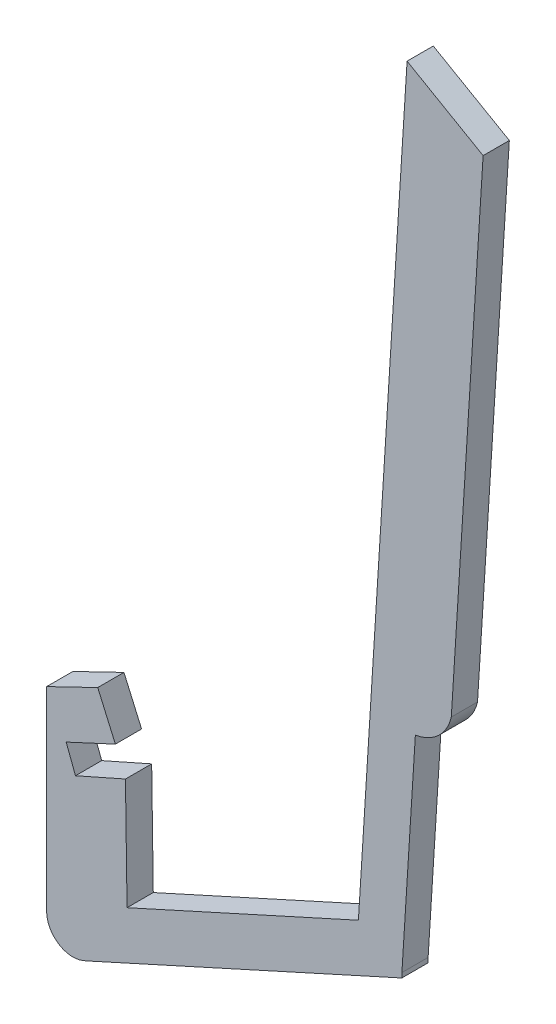
ISO-10303-21;
HEADER;
FILE_DESCRIPTION(('STEP AP214'),'2;1');
FILE_NAME('part.step','',(''),(''),'','','');
FILE_SCHEMA(('AUTOMOTIVE_DESIGN { 1 0 10303 214 1 1 1 1 }'));
ENDSEC;
DATA;
#1=APPLICATION_CONTEXT('core data for automotive mechanical design processes');
#2=APPLICATION_PROTOCOL_DEFINITION('international standard','automotive_design',2000,#1);
#3=PRODUCT_CONTEXT('',#1,'mechanical');
#4=PRODUCT('Part','Part','',(#3));
#5=PRODUCT_RELATED_PRODUCT_CATEGORY('part','',(#4));
#6=PRODUCT_DEFINITION_FORMATION('','',#4);
#7=PRODUCT_DEFINITION_CONTEXT('part definition',#1,'design');
#8=PRODUCT_DEFINITION('design','',#6,#7);
#9=PRODUCT_DEFINITION_SHAPE('','',#8);
#10=(LENGTH_UNIT() NAMED_UNIT(*) SI_UNIT(.MILLI.,.METRE.));
#11=(NAMED_UNIT(*) PLANE_ANGLE_UNIT() SI_UNIT($,.RADIAN.));
#12=(NAMED_UNIT(*) SI_UNIT($,.STERADIAN.) SOLID_ANGLE_UNIT());
#13=UNCERTAINTY_MEASURE_WITH_UNIT(LENGTH_MEASURE(1.E-05),#10,'distance_accuracy_value','');
#14=(GEOMETRIC_REPRESENTATION_CONTEXT(3) GLOBAL_UNCERTAINTY_ASSIGNED_CONTEXT((#13)) GLOBAL_UNIT_ASSIGNED_CONTEXT((#10,
#11,#12)) REPRESENTATION_CONTEXT('',''));
#15=CARTESIAN_POINT('',(0.,0.,0.));
#16=DIRECTION('',(0.,0.,1.));
#17=DIRECTION('',(1.,0.,0.));
#18=AXIS2_PLACEMENT_3D('',#15,#16,#17);
#19=CARTESIAN_POINT('',(787.90645832663,-50.9585268550928,3.));
#20=DIRECTION('',(0.,0.,-1.));
#21=DIRECTION('',(-1.,0.,0.));
#22=AXIS2_PLACEMENT_3D('',#19,#20,#21);
#23=CYLINDRICAL_SURFACE('',#22,10.);
#24=CARTESIAN_POINT('',(787.90645832663,-50.9585268550928,0.));
#25=DIRECTION('',(0.,0.,1.));
#26=DIRECTION('',(-1.,0.,0.));
#27=AXIS2_PLACEMENT_3D('',#24,#25,#26);
#28=CIRCLE('',#27,10.);
#29=CARTESIAN_POINT('',(791.364238457748,-60.3416903176382,0.));
#30=VERTEX_POINT('',#29);
#31=CARTESIAN_POINT('',(792.033370233897,-60.0672368685721,0.));
#32=VERTEX_POINT('',#31);
#33=EDGE_CURVE('E184',#30,#32,#28,.T.);
#34=ORIENTED_EDGE('',*,*,#33,.T.);
#35=DIRECTION('',(0.,0.,-1.));
#36=VECTOR('',#35,1.);
#37=CARTESIAN_POINT('',(792.033370233897,-60.0672368685721,3.));
#38=LINE('',#37,#36);
#39=CARTESIAN_POINT('',(792.033370233897,-60.0672368685721,3.));
#40=VERTEX_POINT('',#39);
#41=EDGE_CURVE('E11',#40,#32,#38,.T.);
#42=ORIENTED_EDGE('',*,*,#41,.F.);
#43=CARTESIAN_POINT('',(787.90645832663,-50.9585268550928,3.));
#44=DIRECTION('',(0.,0.,1.));
#45=DIRECTION('',(-1.,0.,0.));
#46=AXIS2_PLACEMENT_3D('',#43,#44,#45);
#47=CIRCLE('',#46,10.);
#48=CARTESIAN_POINT('',(791.364238457748,-60.3416903176382,3.));
#49=VERTEX_POINT('',#48);
#50=EDGE_CURVE('E216',#49,#40,#47,.T.);
#51=ORIENTED_EDGE('',*,*,#50,.F.);
#52=DIRECTION('',(0.,0.,-1.));
#53=VECTOR('',#52,1.);
#54=CARTESIAN_POINT('',(791.364238457748,-60.3416903176382,3.));
#55=LINE('',#54,#53);
#56=EDGE_CURVE('E180',#49,#30,#55,.T.);
#57=ORIENTED_EDGE('',*,*,#56,.T.);
#58=EDGE_LOOP('',(#34,#42,#51,#57));
#59=FACE_BOUND('',#58,.T.);
#60=ADVANCED_FACE('F34',(#59),#23,.T.);
#61=CARTESIAN_POINT('',(792.033370233897,-60.0672368685721,3.));
#62=DIRECTION('',(-0.412691190726717,0.910871001347921,0.));
#63=DIRECTION('',(-0.910871001347921,-0.412691190726717,0.));
#64=AXIS2_PLACEMENT_3D('',#61,#62,#63);
#65=PLANE('',#64);
#66=DIRECTION('',(0.910871001347921,0.412691190726717,0.));
#67=VECTOR('',#66,1.);
#68=CARTESIAN_POINT('',(792.033370233897,-60.0672368685721,0.));
#69=LINE('',#68,#67);
#70=CARTESIAN_POINT('',(827.968278958337,-43.7860947000329,0.));
#71=VERTEX_POINT('',#70);
#72=EDGE_CURVE('E187',#32,#71,#69,.T.);
#73=ORIENTED_EDGE('',*,*,#72,.T.);
#74=DIRECTION('',(0.,0.,-1.));
#75=VECTOR('',#74,1.);
#76=CARTESIAN_POINT('',(827.968278958337,-43.7860947000329,3.));
#77=LINE('',#76,#75);
#78=CARTESIAN_POINT('',(827.968278958337,-43.7860947000329,3.));
#79=VERTEX_POINT('',#78);
#80=EDGE_CURVE('E42',#79,#71,#77,.T.);
#81=ORIENTED_EDGE('',*,*,#80,.F.);
#82=DIRECTION('',(0.910871001347921,0.412691190726717,0.));
#83=VECTOR('',#82,1.);
#84=CARTESIAN_POINT('',(792.033370233897,-60.0672368685721,3.));
#85=LINE('',#84,#83);
#86=EDGE_CURVE('E120',#40,#79,#85,.T.);
#87=ORIENTED_EDGE('',*,*,#86,.F.);
#88=ORIENTED_EDGE('',*,*,#41,.T.);
#89=EDGE_LOOP('',(#73,#81,#87,#88));
#90=FACE_BOUND('',#89,.T.);
#91=ADVANCED_FACE('F319',(#90),#65,.F.);
#92=CARTESIAN_POINT('',(817.975334928289,-43.4105023514463,3.));
#93=DIRECTION('',(0.,0.,-1.));
#94=DIRECTION('',(-1.,0.,0.));
#95=AXIS2_PLACEMENT_3D('',#92,#93,#94);
#96=CYLINDRICAL_SURFACE('',#95,10.);
#97=CARTESIAN_POINT('',(817.975334928289,-43.4105023514463,0.));
#98=DIRECTION('',(0.,0.,1.));
#99=DIRECTION('',(1.,0.,0.));
#100=AXIS2_PLACEMENT_3D('',#97,#98,#99);
#101=CIRCLE('',#100,10.);
#102=CARTESIAN_POINT('',(827.973978263207,-43.2457860465424,0.));
#103=VERTEX_POINT('',#102);
#104=EDGE_CURVE('E189',#71,#103,#101,.T.);
#105=ORIENTED_EDGE('',*,*,#104,.T.);
#106=DIRECTION('',(0.,0.,-1.));
#107=VECTOR('',#106,1.);
#108=CARTESIAN_POINT('',(827.973978263207,-43.2457860465424,3.));
#109=LINE('',#108,#107);
#110=CARTESIAN_POINT('',(827.973978263207,-43.2457860465424,3.));
#111=VERTEX_POINT('',#110);
#112=EDGE_CURVE('E250',#111,#103,#109,.T.);
#113=ORIENTED_EDGE('',*,*,#112,.F.);
#114=CARTESIAN_POINT('',(817.975334928289,-43.4105023514463,3.));
#115=DIRECTION('',(0.,0.,1.));
#116=DIRECTION('',(1.,0.,0.));
#117=AXIS2_PLACEMENT_3D('',#114,#115,#116);
#118=CIRCLE('',#117,10.);
#119=EDGE_CURVE('E258',#79,#111,#118,.T.);
#120=ORIENTED_EDGE('',*,*,#119,.F.);
#121=ORIENTED_EDGE('',*,*,#80,.T.);
#122=EDGE_LOOP('',(#105,#113,#120,#121));
#123=FACE_BOUND('',#122,.T.);
#124=ADVANCED_FACE('F256',(#123),#96,.T.);
#125=CARTESIAN_POINT('',(827.973978263207,-43.2457860465424,3.));
#126=DIRECTION('',(-0.997998136303589,0.0632433390529176,0.));
#127=DIRECTION('',(-0.0632433390529176,-0.997998136303589,0.));
#128=AXIS2_PLACEMENT_3D('',#125,#126,#127);
#129=PLANE('',#128);
#130=DIRECTION('',(0.0632433390529176,0.997998136303589,0.));
#131=VECTOR('',#130,1.);
#132=CARTESIAN_POINT('',(827.973978263207,-43.2457860465424,0.));
#133=LINE('',#132,#131);
#134=CARTESIAN_POINT('',(829.514372585773,-18.9379192242762,0.));
#135=VERTEX_POINT('',#134);
#136=EDGE_CURVE('E191',#103,#135,#133,.T.);
#137=ORIENTED_EDGE('',*,*,#136,.T.);
#138=DIRECTION('',(0.,0.,-1.));
#139=VECTOR('',#138,1.);
#140=CARTESIAN_POINT('',(829.514372585773,-18.9379192242762,3.));
#141=LINE('',#140,#139);
#142=CARTESIAN_POINT('',(829.514372585773,-18.9379192242762,3.));
#143=VERTEX_POINT('',#142);
#144=EDGE_CURVE('E247',#143,#135,#141,.T.);
#145=ORIENTED_EDGE('',*,*,#144,.F.);
#146=DIRECTION('',(0.0632433390529176,0.997998136303589,0.));
#147=VECTOR('',#146,1.);
#148=CARTESIAN_POINT('',(827.973978263207,-43.2457860465424,3.));
#149=LINE('',#148,#147);
#150=EDGE_CURVE('E276',#111,#143,#149,.T.);
#151=ORIENTED_EDGE('',*,*,#150,.F.);
#152=ORIENTED_EDGE('',*,*,#112,.T.);
#153=EDGE_LOOP('',(#137,#145,#151,#152));
#154=FACE_BOUND('',#153,.T.);
#155=ADVANCED_FACE('F267',(#154),#129,.F.);
#156=CARTESIAN_POINT('',(828.754467182611,-14.0015073447806,3.));
#157=DIRECTION('',(0.,0.,-1.));
#158=DIRECTION('',(-1.,0.,0.));
#159=AXIS2_PLACEMENT_3D('',#156,#157,#158);
#160=CYLINDRICAL_SURFACE('',#159,4.99455888600575);
#161=CARTESIAN_POINT('',(828.754467182611,-14.0015073447806,0.));
#162=DIRECTION('',(0.,0.,1.));
#163=DIRECTION('',(-1.,0.,0.));
#164=AXIS2_PLACEMENT_3D('',#161,#162,#163);
#165=CIRCLE('',#164,4.99455888600575);
#166=CARTESIAN_POINT('',(833.626640717268,-15.1003901929362,0.));
#167=VERTEX_POINT('',#166);
#168=EDGE_CURVE('E193',#135,#167,#165,.T.);
#169=ORIENTED_EDGE('',*,*,#168,.T.);
#170=DIRECTION('',(0.,0.,-1.));
#171=VECTOR('',#170,1.);
#172=CARTESIAN_POINT('',(833.626640717268,-15.1003901929362,3.));
#173=LINE('',#172,#171);
#174=CARTESIAN_POINT('',(833.626640717268,-15.1003901929362,3.));
#175=VERTEX_POINT('',#174);
#176=EDGE_CURVE('E244',#175,#167,#173,.T.);
#177=ORIENTED_EDGE('',*,*,#176,.F.);
#178=CARTESIAN_POINT('',(828.754467182611,-14.0015073447806,3.));
#179=DIRECTION('',(0.,0.,1.));
#180=DIRECTION('',(-1.,0.,0.));
#181=AXIS2_PLACEMENT_3D('',#178,#179,#180);
#182=CIRCLE('',#181,4.99455888600575);
#183=EDGE_CURVE('E273',#143,#175,#182,.T.);
#184=ORIENTED_EDGE('',*,*,#183,.F.);
#185=ORIENTED_EDGE('',*,*,#144,.T.);
#186=EDGE_LOOP('',(#169,#177,#184,#185));
#187=FACE_BOUND('',#186,.T.);
#188=ADVANCED_FACE('F271',(#187),#160,.T.);
#189=CARTESIAN_POINT('',(833.626640717268,-15.1003901929362,3.));
#190=DIRECTION('',(-0.997998136303589,0.0632433390529181,0.));
#191=DIRECTION('',(-0.0632433390529181,-0.997998136303589,0.));
#192=AXIS2_PLACEMENT_3D('',#189,#190,#191);
#193=PLANE('',#192);
#194=DIRECTION('',(0.0632433390529181,0.997998136303589,0.));
#195=VECTOR('',#194,1.);
#196=CARTESIAN_POINT('',(833.626640717268,-15.1003901929362,0.));
#197=LINE('',#196,#195);
#198=CARTESIAN_POINT('',(837.267672807037,42.3561466412564,0.));
#199=VERTEX_POINT('',#198);
#200=EDGE_CURVE('E195',#167,#199,#197,.T.);
#201=ORIENTED_EDGE('',*,*,#200,.T.);
#202=DIRECTION('',(0.,0.,-1.));
#203=VECTOR('',#202,1.);
#204=CARTESIAN_POINT('',(837.267672807037,42.3561466412564,3.));
#205=LINE('',#204,#203);
#206=CARTESIAN_POINT('',(837.267672807037,42.3561466412564,3.));
#207=VERTEX_POINT('',#206);
#208=EDGE_CURVE('E241',#207,#199,#205,.T.);
#209=ORIENTED_EDGE('',*,*,#208,.F.);
#210=DIRECTION('',(0.0632433390529181,0.997998136303589,0.));
#211=VECTOR('',#210,1.);
#212=CARTESIAN_POINT('',(833.626640717268,-15.1003901929362,3.));
#213=LINE('',#212,#211);
#214=EDGE_CURVE('E275',#175,#207,#213,.T.);
#215=ORIENTED_EDGE('',*,*,#214,.F.);
#216=ORIENTED_EDGE('',*,*,#176,.T.);
#217=EDGE_LOOP('',(#201,#209,#215,#216));
#218=FACE_BOUND('',#217,.T.);
#219=ADVANCED_FACE('F332',(#218),#193,.F.);
#220=CARTESIAN_POINT('',(837.267672807037,42.3561466412564,3.));
#221=DIRECTION('',(-0.499064113788178,-0.866565064105876,0.));
#222=DIRECTION('',(0.866565064105876,-0.499064113788178,0.));
#223=AXIS2_PLACEMENT_3D('',#220,#221,#222);
#224=PLANE('',#223);
#225=DIRECTION('',(-0.866565064105876,0.499064113788178,0.));
#226=VECTOR('',#225,1.);
#227=CARTESIAN_POINT('',(837.267672807037,42.3561466412564,0.));
#228=LINE('',#227,#226);
#229=CARTESIAN_POINT('',(828.567150471694,47.3668707618538,0.));
#230=VERTEX_POINT('',#229);
#231=EDGE_CURVE('E197',#199,#230,#228,.T.);
#232=ORIENTED_EDGE('',*,*,#231,.T.);
#233=DIRECTION('',(0.,0.,-1.));
#234=VECTOR('',#233,1.);
#235=CARTESIAN_POINT('',(828.567150471694,47.3668707618538,3.));
#236=LINE('',#235,#234);
#237=CARTESIAN_POINT('',(828.567150471694,47.3668707618538,3.));
#238=VERTEX_POINT('',#237);
#239=EDGE_CURVE('E238',#238,#230,#236,.T.);
#240=ORIENTED_EDGE('',*,*,#239,.F.);
#241=DIRECTION('',(-0.866565064105876,0.499064113788178,0.));
#242=VECTOR('',#241,1.);
#243=CARTESIAN_POINT('',(837.267672807037,42.3561466412564,3.));
#244=LINE('',#243,#242);
#245=EDGE_CURVE('E278',#207,#238,#244,.T.);
#246=ORIENTED_EDGE('',*,*,#245,.F.);
#247=ORIENTED_EDGE('',*,*,#208,.T.);
#248=EDGE_LOOP('',(#232,#240,#246,#247));
#249=FACE_BOUND('',#248,.T.);
#250=ADVANCED_FACE('F335',(#249),#224,.F.);
#251=CARTESIAN_POINT('',(828.567150471694,47.3668707618538,3.));
#252=DIRECTION('',(0.997998136303589,-0.0632433390529176,0.));
#253=DIRECTION('',(0.0632433390529176,0.997998136303589,0.));
#254=AXIS2_PLACEMENT_3D('',#251,#252,#253);
#255=PLANE('',#254);
#256=DIRECTION('',(-0.0632433390529176,-0.997998136303589,0.));
#257=VECTOR('',#256,1.);
#258=CARTESIAN_POINT('',(828.567150471694,47.3668707618538,0.));
#259=LINE('',#258,#257);
#260=CARTESIAN_POINT('',(822.996025927341,-40.54708184788,0.));
#261=VERTEX_POINT('',#260);
#262=EDGE_CURVE('E199',#230,#261,#259,.T.);
#263=ORIENTED_EDGE('',*,*,#262,.T.);
#264=DIRECTION('',(0.,0.,-1.));
#265=VECTOR('',#264,1.);
#266=CARTESIAN_POINT('',(822.996025927341,-40.54708184788,3.));
#267=LINE('',#266,#265);
#268=CARTESIAN_POINT('',(822.996025927341,-40.54708184788,3.));
#269=VERTEX_POINT('',#268);
#270=EDGE_CURVE('E235',#269,#261,#267,.T.);
#271=ORIENTED_EDGE('',*,*,#270,.F.);
#272=DIRECTION('',(-0.0632433390529176,-0.997998136303589,0.));
#273=VECTOR('',#272,1.);
#274=CARTESIAN_POINT('',(828.567150471694,47.3668707618538,3.));
#275=LINE('',#274,#273);
#276=EDGE_CURVE('E284',#238,#269,#275,.T.);
#277=ORIENTED_EDGE('',*,*,#276,.F.);
#278=ORIENTED_EDGE('',*,*,#239,.T.);
#279=EDGE_LOOP('',(#263,#271,#277,#278));
#280=FACE_BOUND('',#279,.T.);
#281=ADVANCED_FACE('F339',(#280),#255,.F.);
#282=CARTESIAN_POINT('',(822.996025927341,-40.54708184788,3.));
#283=DIRECTION('',(0.412691190726715,-0.910871001347922,0.));
#284=DIRECTION('',(0.910871001347922,0.412691190726716,0.));
#285=AXIS2_PLACEMENT_3D('',#282,#283,#284);
#286=PLANE('',#285);
#287=DIRECTION('',(-0.910871001347922,-0.412691190726715,0.));
#288=VECTOR('',#287,1.);
#289=CARTESIAN_POINT('',(822.996025927341,-40.54708184788,0.));
#290=LINE('',#289,#288);
#291=CARTESIAN_POINT('',(796.525541864344,-52.5401473543074,0.));
#292=VERTEX_POINT('',#291);
#293=EDGE_CURVE('E201',#261,#292,#290,.T.);
#294=ORIENTED_EDGE('',*,*,#293,.T.);
#295=DIRECTION('',(0.,0.,-1.));
#296=VECTOR('',#295,1.);
#297=CARTESIAN_POINT('',(796.525541864344,-52.5401473543074,3.));
#298=LINE('',#297,#296);
#299=CARTESIAN_POINT('',(796.525541864344,-52.5401473543074,3.));
#300=VERTEX_POINT('',#299);
#301=EDGE_CURVE('E232',#300,#292,#298,.T.);
#302=ORIENTED_EDGE('',*,*,#301,.F.);
#303=DIRECTION('',(-0.910871001347922,-0.412691190726715,0.));
#304=VECTOR('',#303,1.);
#305=CARTESIAN_POINT('',(822.996025927341,-40.54708184788,3.));
#306=LINE('',#305,#304);
#307=EDGE_CURVE('E286',#269,#300,#306,.T.);
#308=ORIENTED_EDGE('',*,*,#307,.F.);
#309=ORIENTED_EDGE('',*,*,#270,.T.);
#310=EDGE_LOOP('',(#294,#302,#308,#309));
#311=FACE_BOUND('',#310,.T.);
#312=ADVANCED_FACE('F343',(#311),#286,.F.);
#313=CARTESIAN_POINT('',(796.525541864344,-52.5401473543074,3.));
#314=DIRECTION('',(-0.99989545053581,-0.0144598754416725,0.));
#315=DIRECTION('',(0.0144598754416725,-0.999895450535811,0.));
#316=AXIS2_PLACEMENT_3D('',#313,#314,#315);
#317=PLANE('',#316);
#318=DIRECTION('',(-0.0144598754416725,0.99989545053581,0.));
#319=VECTOR('',#318,1.);
#320=CARTESIAN_POINT('',(796.525541864344,-52.5401473543074,0.));
#321=LINE('',#320,#319);
#322=CARTESIAN_POINT('',(796.342472939543,-39.8809936996871,0.));
#323=VERTEX_POINT('',#322);
#324=EDGE_CURVE('E203',#292,#323,#321,.T.);
#325=ORIENTED_EDGE('',*,*,#324,.T.);
#326=DIRECTION('',(0.,0.,-1.));
#327=VECTOR('',#326,1.);
#328=CARTESIAN_POINT('',(796.342472939543,-39.8809936996871,3.));
#329=LINE('',#328,#327);
#330=CARTESIAN_POINT('',(796.342472939543,-39.8809936996871,3.));
#331=VERTEX_POINT('',#330);
#332=EDGE_CURVE('E229',#331,#323,#329,.T.);
#333=ORIENTED_EDGE('',*,*,#332,.F.);
#334=DIRECTION('',(-0.0144598754416725,0.99989545053581,0.));
#335=VECTOR('',#334,1.);
#336=CARTESIAN_POINT('',(796.525541864344,-52.5401473543074,3.));
#337=LINE('',#336,#335);
#338=EDGE_CURVE('E288',#300,#331,#337,.T.);
#339=ORIENTED_EDGE('',*,*,#338,.F.);
#340=ORIENTED_EDGE('',*,*,#301,.T.);
#341=EDGE_LOOP('',(#325,#333,#339,#340));
#342=FACE_BOUND('',#341,.T.);
#343=ADVANCED_FACE('F347',(#342),#317,.F.);
#344=CARTESIAN_POINT('',(796.342472939543,-39.8809936996871,3.));
#345=DIRECTION('',(0.405265887863436,-0.914198862466072,0.));
#346=DIRECTION('',(0.914198862466072,0.405265887863436,0.));
#347=AXIS2_PLACEMENT_3D('',#344,#345,#346);
#348=PLANE('',#347);
#349=DIRECTION('',(-0.914198862466072,-0.405265887863436,0.));
#350=VECTOR('',#349,1.);
#351=CARTESIAN_POINT('',(796.342472939543,-39.8809936996871,0.));
#352=LINE('',#351,#350);
#353=CARTESIAN_POINT('',(790.624612073334,-42.4157310044054,0.));
#354=VERTEX_POINT('',#353);
#355=EDGE_CURVE('E205',#323,#354,#352,.T.);
#356=ORIENTED_EDGE('',*,*,#355,.T.);
#357=DIRECTION('',(0.,0.,-1.));
#358=VECTOR('',#357,1.);
#359=CARTESIAN_POINT('',(790.624612073334,-42.4157310044054,3.));
#360=LINE('',#359,#358);
#361=CARTESIAN_POINT('',(790.624612073334,-42.4157310044054,3.));
#362=VERTEX_POINT('',#361);
#363=EDGE_CURVE('E226',#362,#354,#360,.T.);
#364=ORIENTED_EDGE('',*,*,#363,.F.);
#365=DIRECTION('',(-0.914198862466072,-0.405265887863436,0.));
#366=VECTOR('',#365,1.);
#367=CARTESIAN_POINT('',(796.342472939543,-39.8809936996871,3.));
#368=LINE('',#367,#366);
#369=EDGE_CURVE('E290',#331,#362,#368,.T.);
#370=ORIENTED_EDGE('',*,*,#369,.F.);
#371=ORIENTED_EDGE('',*,*,#332,.T.);
#372=EDGE_LOOP('',(#356,#364,#370,#371));
#373=FACE_BOUND('',#372,.T.);
#374=ADVANCED_FACE('F351',(#373),#348,.F.);
#375=CARTESIAN_POINT('',(790.624612073334,-42.4157310044054,3.));
#376=DIRECTION('',(-0.934950638873828,-0.35477782183984,0.));
#377=DIRECTION('',(0.35477782183984,-0.934950638873828,0.));
#378=AXIS2_PLACEMENT_3D('',#375,#376,#377);
#379=PLANE('',#378);
#380=DIRECTION('',(-0.35477782183984,0.934950638873827,0.));
#381=VECTOR('',#380,1.);
#382=CARTESIAN_POINT('',(790.624612073334,-42.4157310044054,0.));
#383=LINE('',#382,#381);
#384=CARTESIAN_POINT('',(789.560278607815,-39.610879087784,0.));
#385=VERTEX_POINT('',#384);
#386=EDGE_CURVE('E207',#354,#385,#383,.T.);
#387=ORIENTED_EDGE('',*,*,#386,.T.);
#388=DIRECTION('',(0.,0.,-1.));
#389=VECTOR('',#388,1.);
#390=CARTESIAN_POINT('',(789.560278607815,-39.610879087784,3.));
#391=LINE('',#390,#389);
#392=CARTESIAN_POINT('',(789.560278607815,-39.610879087784,3.));
#393=VERTEX_POINT('',#392);
#394=EDGE_CURVE('E223',#393,#385,#391,.T.);
#395=ORIENTED_EDGE('',*,*,#394,.F.);
#396=DIRECTION('',(-0.35477782183984,0.934950638873827,0.));
#397=VECTOR('',#396,1.);
#398=CARTESIAN_POINT('',(790.624612073334,-42.4157310044054,3.));
#399=LINE('',#398,#397);
#400=EDGE_CURVE('E292',#362,#393,#399,.T.);
#401=ORIENTED_EDGE('',*,*,#400,.F.);
#402=ORIENTED_EDGE('',*,*,#363,.T.);
#403=EDGE_LOOP('',(#387,#395,#401,#402));
#404=FACE_BOUND('',#403,.T.);
#405=ADVANCED_FACE('F355',(#404),#379,.F.);
#406=CARTESIAN_POINT('',(789.560278607815,-39.610879087784,3.));
#407=DIRECTION('',(-0.420525813777719,0.907280573993837,0.));
#408=DIRECTION('',(-0.907280573993837,-0.420525813777719,0.));
#409=AXIS2_PLACEMENT_3D('',#406,#407,#408);
#410=PLANE('',#409);
#411=DIRECTION('',(0.907280573993837,0.420525813777719,0.));
#412=VECTOR('',#411,1.);
#413=CARTESIAN_POINT('',(789.560278607815,-39.610879087784,0.));
#414=LINE('',#413,#412);
#415=CARTESIAN_POINT('',(795.188053446918,-37.0023975862415,0.));
#416=VERTEX_POINT('',#415);
#417=EDGE_CURVE('E209',#385,#416,#414,.T.);
#418=ORIENTED_EDGE('',*,*,#417,.T.);
#419=DIRECTION('',(0.,0.,-1.));
#420=VECTOR('',#419,1.);
#421=CARTESIAN_POINT('',(795.188053446918,-37.0023975862415,3.));
#422=LINE('',#421,#420);
#423=CARTESIAN_POINT('',(795.188053446918,-37.0023975862415,3.));
#424=VERTEX_POINT('',#423);
#425=EDGE_CURVE('E220',#424,#416,#422,.T.);
#426=ORIENTED_EDGE('',*,*,#425,.F.);
#427=DIRECTION('',(0.907280573993837,0.420525813777719,0.));
#428=VECTOR('',#427,1.);
#429=CARTESIAN_POINT('',(789.560278607815,-39.610879087784,3.));
#430=LINE('',#429,#428);
#431=EDGE_CURVE('E294',#393,#424,#430,.T.);
#432=ORIENTED_EDGE('',*,*,#431,.F.);
#433=ORIENTED_EDGE('',*,*,#394,.T.);
#434=EDGE_LOOP('',(#418,#426,#432,#433));
#435=FACE_BOUND('',#434,.T.);
#436=ADVANCED_FACE('F300',(#435),#410,.F.);
#437=CARTESIAN_POINT('',(795.188053446918,-37.0023975862415,3.));
#438=DIRECTION('',(-0.91588963044038,-0.401430174316511,0.));
#439=DIRECTION('',(0.401430174316511,-0.91588963044038,0.));
#440=AXIS2_PLACEMENT_3D('',#437,#438,#439);
#441=PLANE('',#440);
#442=DIRECTION('',(-0.401430174316511,0.91588963044038,0.));
#443=VECTOR('',#442,1.);
#444=CARTESIAN_POINT('',(795.188053446918,-37.0023975862415,0.));
#445=LINE('',#444,#443);
#446=CARTESIAN_POINT('',(793.171716745566,-32.401991352731,0.));
#447=VERTEX_POINT('',#446);
#448=EDGE_CURVE('E211',#416,#447,#445,.T.);
#449=ORIENTED_EDGE('',*,*,#448,.T.);
#450=DIRECTION('',(0.,0.,-1.));
#451=VECTOR('',#450,1.);
#452=CARTESIAN_POINT('',(793.171716745566,-32.401991352731,3.));
#453=LINE('',#452,#451);
#454=CARTESIAN_POINT('',(793.171716745566,-32.401991352731,3.));
#455=VERTEX_POINT('',#454);
#456=EDGE_CURVE('E175',#455,#447,#453,.T.);
#457=ORIENTED_EDGE('',*,*,#456,.F.);
#458=DIRECTION('',(-0.401430174316511,0.91588963044038,0.));
#459=VECTOR('',#458,1.);
#460=CARTESIAN_POINT('',(795.188053446918,-37.0023975862415,3.));
#461=LINE('',#460,#459);
#462=EDGE_CURVE('E166',#424,#455,#461,.T.);
#463=ORIENTED_EDGE('',*,*,#462,.F.);
#464=ORIENTED_EDGE('',*,*,#425,.T.);
#465=EDGE_LOOP('',(#449,#457,#463,#464));
#466=FACE_BOUND('',#465,.T.);
#467=ADVANCED_FACE('F304',(#466),#441,.F.);
#468=CARTESIAN_POINT('',(793.171716745566,-32.401991352731,3.));
#469=DIRECTION('',(0.43559708162387,-0.900141756880975,0.));
#470=DIRECTION('',(0.900141756880975,0.43559708162387,0.));
#471=AXIS2_PLACEMENT_3D('',#468,#469,#470);
#472=PLANE('',#471);
#473=DIRECTION('',(-0.900141756880975,-0.43559708162387,0.));
#474=VECTOR('',#473,1.);
#475=CARTESIAN_POINT('',(793.171716745566,-32.401991352731,0.));
#476=LINE('',#475,#474);
#477=CARTESIAN_POINT('',(787.326904418412,-35.2304160679328,0.));
#478=VERTEX_POINT('',#477);
#479=EDGE_CURVE('E174',#447,#478,#476,.T.);
#480=ORIENTED_EDGE('',*,*,#479,.T.);
#481=DIRECTION('',(0.,0.,-1.));
#482=VECTOR('',#481,1.);
#483=CARTESIAN_POINT('',(787.326904418412,-35.2304160679328,3.));
#484=LINE('',#483,#482);
#485=CARTESIAN_POINT('',(787.326904418412,-35.2304160679328,3.));
#486=VERTEX_POINT('',#485);
#487=EDGE_CURVE('E171',#486,#478,#484,.T.);
#488=ORIENTED_EDGE('',*,*,#487,.F.);
#489=DIRECTION('',(-0.900141756880975,-0.43559708162387,0.));
#490=VECTOR('',#489,1.);
#491=CARTESIAN_POINT('',(793.171716745566,-32.401991352731,3.));
#492=LINE('',#491,#490);
#493=EDGE_CURVE('E160',#455,#486,#492,.T.);
#494=ORIENTED_EDGE('',*,*,#493,.F.);
#495=ORIENTED_EDGE('',*,*,#456,.T.);
#496=EDGE_LOOP('',(#480,#488,#494,#495));
#497=FACE_BOUND('',#496,.T.);
#498=ADVANCED_FACE('F172',(#497),#472,.F.);
#499=CARTESIAN_POINT('',(787.326904418412,-35.2304160679328,3.));
#500=DIRECTION('',(1.,0.,0.));
#501=DIRECTION('',(0.,0.,-1.));
#502=AXIS2_PLACEMENT_3D('',#499,#500,#501);
#503=PLANE('',#502);
#504=DIRECTION('',(0.,-1.,0.));
#505=VECTOR('',#504,1.);
#506=CARTESIAN_POINT('',(787.326904418412,-35.2304160679328,0.));
#507=LINE('',#506,#505);
#508=CARTESIAN_POINT('',(787.326904418412,-57.5267412788746,0.));
#509=VERTEX_POINT('',#508);
#510=EDGE_CURVE('E106',#478,#509,#507,.T.);
#511=ORIENTED_EDGE('',*,*,#510,.T.);
#512=DIRECTION('',(0.,0.,-1.));
#513=VECTOR('',#512,1.);
#514=CARTESIAN_POINT('',(787.326904418412,-57.5267412788746,3.));
#515=LINE('',#514,#513);
#516=CARTESIAN_POINT('',(787.326904418412,-57.5267412788746,3.));
#517=VERTEX_POINT('',#516);
#518=EDGE_CURVE('E176',#517,#509,#515,.T.);
#519=ORIENTED_EDGE('',*,*,#518,.F.);
#520=DIRECTION('',(0.,-1.,0.));
#521=VECTOR('',#520,1.);
#522=CARTESIAN_POINT('',(787.326904418412,-35.2304160679328,3.));
#523=LINE('',#522,#521);
#524=EDGE_CURVE('E164',#486,#517,#523,.T.);
#525=ORIENTED_EDGE('',*,*,#524,.F.);
#526=ORIENTED_EDGE('',*,*,#487,.T.);
#527=EDGE_LOOP('',(#511,#519,#525,#526));
#528=FACE_BOUND('',#527,.T.);
#529=ADVANCED_FACE('F178',(#528),#503,.F.);
#530=CARTESIAN_POINT('',(790.326904418412,-57.5267412788746,3.));
#531=DIRECTION('',(0.,0.,-1.));
#532=DIRECTION('',(-1.,0.,0.));
#533=AXIS2_PLACEMENT_3D('',#530,#531,#532);
#534=CYLINDRICAL_SURFACE('',#533,3.00000000000001);
#535=CARTESIAN_POINT('',(790.326904418412,-57.5267412788746,0.));
#536=DIRECTION('',(0.,0.,1.));
#537=DIRECTION('',(-1.,0.,0.));
#538=AXIS2_PLACEMENT_3D('',#535,#536,#537);
#539=CIRCLE('',#538,3.00000000000001);
#540=EDGE_CURVE('E112',#509,#30,#539,.T.);
#541=ORIENTED_EDGE('',*,*,#540,.T.);
#542=ORIENTED_EDGE('',*,*,#56,.F.);
#543=CARTESIAN_POINT('',(790.326904418412,-57.5267412788746,3.));
#544=DIRECTION('',(0.,0.,1.));
#545=DIRECTION('',(-1.,0.,0.));
#546=AXIS2_PLACEMENT_3D('',#543,#544,#545);
#547=CIRCLE('',#546,3.00000000000001);
#548=EDGE_CURVE('E50',#517,#49,#547,.T.);
#549=ORIENTED_EDGE('',*,*,#548,.F.);
#550=ORIENTED_EDGE('',*,*,#518,.T.);
#551=EDGE_LOOP('',(#541,#542,#549,#550));
#552=FACE_BOUND('',#551,.T.);
#553=ADVANCED_FACE('F308',(#552),#534,.T.);
#554=CARTESIAN_POINT('',(787.90645832663,-50.9585268550928,3.));
#555=DIRECTION('',(0.,0.,-1.));
#556=DIRECTION('',(-1.,0.,0.));
#557=AXIS2_PLACEMENT_3D('',#554,#555,#556);
#558=PLANE('',#557);
#559=ORIENTED_EDGE('',*,*,#50,.T.);
#560=ORIENTED_EDGE('',*,*,#86,.T.);
#561=ORIENTED_EDGE('',*,*,#119,.T.);
#562=ORIENTED_EDGE('',*,*,#150,.T.);
#563=ORIENTED_EDGE('',*,*,#183,.T.);
#564=ORIENTED_EDGE('',*,*,#214,.T.);
#565=ORIENTED_EDGE('',*,*,#245,.T.);
#566=ORIENTED_EDGE('',*,*,#276,.T.);
#567=ORIENTED_EDGE('',*,*,#307,.T.);
#568=ORIENTED_EDGE('',*,*,#338,.T.);
#569=ORIENTED_EDGE('',*,*,#369,.T.);
#570=ORIENTED_EDGE('',*,*,#400,.T.);
#571=ORIENTED_EDGE('',*,*,#431,.T.);
#572=ORIENTED_EDGE('',*,*,#462,.T.);
#573=ORIENTED_EDGE('',*,*,#493,.T.);
#574=ORIENTED_EDGE('',*,*,#524,.T.);
#575=ORIENTED_EDGE('',*,*,#548,.T.);
#576=EDGE_LOOP('',(#559,#560,#561,#562,#563,#564,#565,#566,#567,#568,#569,#570,#571,#572,#573,
#574,#575));
#577=FACE_BOUND('',#576,.T.);
#578=ADVANCED_FACE('F162',(#577),#558,.F.);
#579=CARTESIAN_POINT('',(787.90645832663,-50.9585268550928,0.));
#580=DIRECTION('',(0.,0.,-1.));
#581=DIRECTION('',(-1.,0.,0.));
#582=AXIS2_PLACEMENT_3D('',#579,#580,#581);
#583=PLANE('',#582);
#584=ORIENTED_EDGE('',*,*,#33,.F.);
#585=ORIENTED_EDGE('',*,*,#540,.F.);
#586=ORIENTED_EDGE('',*,*,#510,.F.);
#587=ORIENTED_EDGE('',*,*,#479,.F.);
#588=ORIENTED_EDGE('',*,*,#448,.F.);
#589=ORIENTED_EDGE('',*,*,#417,.F.);
#590=ORIENTED_EDGE('',*,*,#386,.F.);
#591=ORIENTED_EDGE('',*,*,#355,.F.);
#592=ORIENTED_EDGE('',*,*,#324,.F.);
#593=ORIENTED_EDGE('',*,*,#293,.F.);
#594=ORIENTED_EDGE('',*,*,#262,.F.);
#595=ORIENTED_EDGE('',*,*,#231,.F.);
#596=ORIENTED_EDGE('',*,*,#200,.F.);
#597=ORIENTED_EDGE('',*,*,#168,.F.);
#598=ORIENTED_EDGE('',*,*,#136,.F.);
#599=ORIENTED_EDGE('',*,*,#104,.F.);
#600=ORIENTED_EDGE('',*,*,#72,.F.);
#601=EDGE_LOOP('',(#584,#585,#586,#587,#588,#589,#590,#591,#592,#593,#594,#595,#596,#597,#598,
#599,#600));
#602=FACE_BOUND('',#601,.T.);
#603=ADVANCED_FACE('F262',(#602),#583,.T.);
#604=CLOSED_SHELL('',(#60,#91,#124,#155,#188,#219,#250,#281,#312,#343,#374,#405,#436,#467,#498,
#529,#553,#578,#603));
#605=MANIFOLD_SOLID_BREP('B2',#604);
#606=ADVANCED_BREP_SHAPE_REPRESENTATION('',(#18,#605),#14);
#607=SHAPE_DEFINITION_REPRESENTATION(#9,#606);
ENDSEC;
END-ISO-10303-21;
